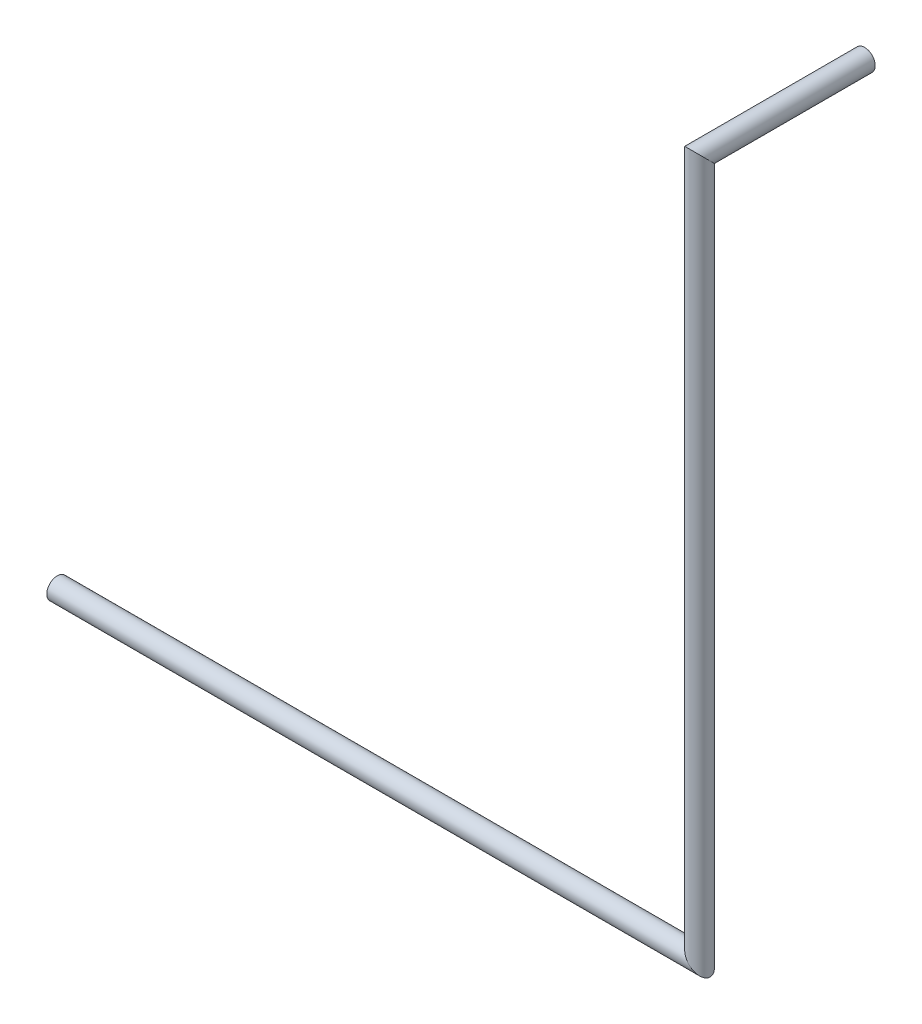
ISO-10303-21;
HEADER;
FILE_DESCRIPTION(('STEP AP214'),'2;1');
FILE_NAME('part.step','',(''),(''),'','','');
FILE_SCHEMA(('AUTOMOTIVE_DESIGN { 1 0 10303 214 1 1 1 1 }'));
ENDSEC;
DATA;
#1=APPLICATION_CONTEXT('core data for automotive mechanical design processes');
#2=APPLICATION_PROTOCOL_DEFINITION('international standard','automotive_design',2000,#1);
#3=PRODUCT_CONTEXT('',#1,'mechanical');
#4=PRODUCT('Part','Part','',(#3));
#5=PRODUCT_RELATED_PRODUCT_CATEGORY('part','',(#4));
#6=PRODUCT_DEFINITION_FORMATION('','',#4);
#7=PRODUCT_DEFINITION_CONTEXT('part definition',#1,'design');
#8=PRODUCT_DEFINITION('design','',#6,#7);
#9=PRODUCT_DEFINITION_SHAPE('','',#8);
#10=(LENGTH_UNIT() NAMED_UNIT(*) SI_UNIT(.MILLI.,.METRE.));
#11=(NAMED_UNIT(*) PLANE_ANGLE_UNIT() SI_UNIT($,.RADIAN.));
#12=(NAMED_UNIT(*) SI_UNIT($,.STERADIAN.) SOLID_ANGLE_UNIT());
#13=UNCERTAINTY_MEASURE_WITH_UNIT(LENGTH_MEASURE(1.E-05),#10,'distance_accuracy_value','');
#14=(GEOMETRIC_REPRESENTATION_CONTEXT(3) GLOBAL_UNCERTAINTY_ASSIGNED_CONTEXT((#13)) GLOBAL_UNIT_ASSIGNED_CONTEXT((#10,
#11,#12)) REPRESENTATION_CONTEXT('',''));
#15=CARTESIAN_POINT('',(0.,0.,0.));
#16=DIRECTION('',(0.,0.,1.));
#17=DIRECTION('',(1.,0.,0.));
#18=AXIS2_PLACEMENT_3D('',#15,#16,#17);
#19=CARTESIAN_POINT('',(152.47,165.26,-39.19));
#20=DIRECTION('',(0.,0.,-1.));
#21=DIRECTION('',(0.,-1.,0.));
#22=AXIS2_PLACEMENT_3D('',#19,#20,#21);
#23=PLANE('',#22);
#24=CARTESIAN_POINT('',(152.47,165.26,-39.19));
#25=DIRECTION('',(0.,0.,-1.));
#26=DIRECTION('',(0.,-1.,0.));
#27=AXIS2_PLACEMENT_3D('',#24,#25,#26);
#28=CIRCLE('',#27,2.5);
#29=CARTESIAN_POINT('',(152.47,162.76,-39.19));
#30=VERTEX_POINT('',#29);
#31=EDGE_CURVE('E44',#30,#30,#28,.T.);
#32=ORIENTED_EDGE('',*,*,#31,.T.);
#33=EDGE_LOOP('',(#32));
#34=FACE_BOUND('',#33,.T.);
#35=ADVANCED_FACE('F41',(#34),#23,.T.);
#36=CARTESIAN_POINT('',(0.,0.,0.));
#37=DIRECTION('',(1.,0.,0.));
#38=DIRECTION('',(0.,0.,-1.));
#39=AXIS2_PLACEMENT_3D('',#36,#37,#38);
#40=PLANE('',#39);
#41=CARTESIAN_POINT('',(0.,0.,0.));
#42=DIRECTION('',(1.,0.,0.));
#43=DIRECTION('',(0.,0.,-1.));
#44=AXIS2_PLACEMENT_3D('',#41,#42,#43);
#45=CIRCLE('',#44,2.5);
#46=CARTESIAN_POINT('',(0.,0.,-2.5));
#47=VERTEX_POINT('',#46);
#48=EDGE_CURVE('E48',#47,#47,#45,.T.);
#49=ORIENTED_EDGE('',*,*,#48,.F.);
#50=EDGE_LOOP('',(#49));
#51=FACE_BOUND('',#50,.T.);
#52=ADVANCED_FACE('F65',(#51),#40,.F.);
#53=CARTESIAN_POINT('',(152.47,165.26,2.84999999999997));
#54=DIRECTION('',(0.,0.,-1.));
#55=DIRECTION('',(-1.,0.,0.));
#56=AXIS2_PLACEMENT_3D('',#53,#54,#55);
#57=CYLINDRICAL_SURFACE('',#56,2.5);
#58=CARTESIAN_POINT('',(152.47,165.26,0.));
#59=DIRECTION('',(0.,0.707106781186548,-0.707106781186548));
#60=DIRECTION('',(0.,0.707106781186548,0.707106781186548));
#61=AXIS2_PLACEMENT_3D('',#58,#59,#60);
#62=ELLIPSE('',#61,3.53553390593274,2.5);
#63=CARTESIAN_POINT('',(152.47,167.76,2.5));
#64=VERTEX_POINT('',#63);
#65=EDGE_CURVE('E53',#64,#64,#62,.F.);
#66=ORIENTED_EDGE('',*,*,#65,.F.);
#67=EDGE_LOOP('',(#66));
#68=FACE_BOUND('',#67,.T.);
#69=ORIENTED_EDGE('',*,*,#31,.F.);
#70=EDGE_LOOP('',(#69));
#71=FACE_BOUND('',#70,.T.);
#72=ADVANCED_FACE('F62',(#68,#71),#57,.T.);
#73=CARTESIAN_POINT('',(152.47,-5.59999999999997,0.));
#74=DIRECTION('',(0.,1.,0.));
#75=DIRECTION('',(0.,0.,1.));
#76=AXIS2_PLACEMENT_3D('',#73,#74,#75);
#77=CYLINDRICAL_SURFACE('',#76,2.5);
#78=CARTESIAN_POINT('',(152.47,0.,0.));
#79=DIRECTION('',(0.707106781186548,0.707106781186548,0.));
#80=DIRECTION('',(0.707106781186548,-0.707106781186548,0.));
#81=AXIS2_PLACEMENT_3D('',#78,#79,#80);
#82=ELLIPSE('',#81,3.53553390593274,2.5);
#83=CARTESIAN_POINT('',(154.97,-2.5,0.));
#84=VERTEX_POINT('',#83);
#85=EDGE_CURVE('E10',#84,#84,#82,.F.);
#86=ORIENTED_EDGE('',*,*,#85,.F.);
#87=EDGE_LOOP('',(#86));
#88=FACE_BOUND('',#87,.T.);
#89=ORIENTED_EDGE('',*,*,#65,.T.);
#90=EDGE_LOOP('',(#89));
#91=FACE_BOUND('',#90,.T.);
#92=ADVANCED_FACE('F64',(#88,#91),#77,.T.);
#93=CARTESIAN_POINT('',(0.,0.,0.));
#94=DIRECTION('',(1.,0.,0.));
#95=DIRECTION('',(0.,0.,-1.));
#96=AXIS2_PLACEMENT_3D('',#93,#94,#95);
#97=CYLINDRICAL_SURFACE('',#96,2.5);
#98=ORIENTED_EDGE('',*,*,#48,.T.);
#99=EDGE_LOOP('',(#98));
#100=FACE_BOUND('',#99,.T.);
#101=ORIENTED_EDGE('',*,*,#85,.T.);
#102=EDGE_LOOP('',(#101));
#103=FACE_BOUND('',#102,.T.);
#104=ADVANCED_FACE('F72',(#100,#103),#97,.T.);
#105=CLOSED_SHELL('',(#35,#52,#72,#92,#104));
#106=MANIFOLD_SOLID_BREP('B2',#105);
#107=ADVANCED_BREP_SHAPE_REPRESENTATION('',(#18,#106),#14);
#108=SHAPE_DEFINITION_REPRESENTATION(#9,#107);
ENDSEC;
END-ISO-10303-21;
